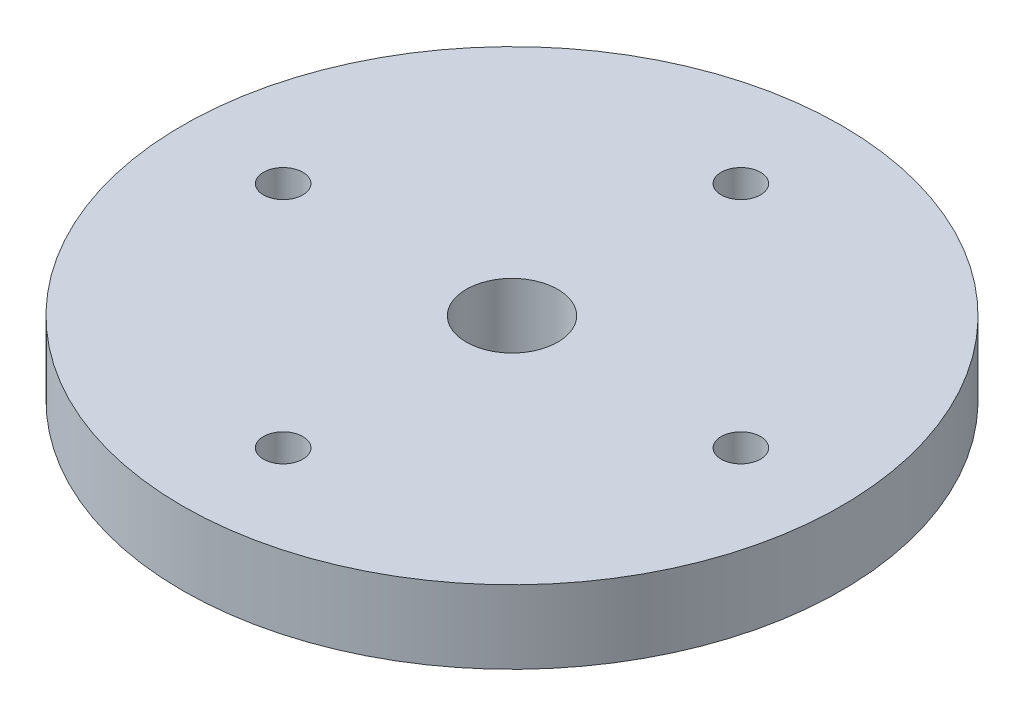
ISO-10303-21;
HEADER;
FILE_DESCRIPTION(('STEP AP214'),'2;1');
FILE_NAME('part.step','',(''),(''),'','','');
FILE_SCHEMA(('AUTOMOTIVE_DESIGN { 1 0 10303 214 1 1 1 1 }'));
ENDSEC;
DATA;
#1=APPLICATION_CONTEXT('core data for automotive mechanical design processes');
#2=APPLICATION_PROTOCOL_DEFINITION('international standard','automotive_design',2000,#1);
#3=PRODUCT_CONTEXT('',#1,'mechanical');
#4=PRODUCT('Part','Part','',(#3));
#5=PRODUCT_RELATED_PRODUCT_CATEGORY('part','',(#4));
#6=PRODUCT_DEFINITION_FORMATION('','',#4);
#7=PRODUCT_DEFINITION_CONTEXT('part definition',#1,'design');
#8=PRODUCT_DEFINITION('design','',#6,#7);
#9=PRODUCT_DEFINITION_SHAPE('','',#8);
#10=(LENGTH_UNIT() NAMED_UNIT(*) SI_UNIT(.MILLI.,.METRE.));
#11=(NAMED_UNIT(*) PLANE_ANGLE_UNIT() SI_UNIT($,.RADIAN.));
#12=(NAMED_UNIT(*) SI_UNIT($,.STERADIAN.) SOLID_ANGLE_UNIT());
#13=UNCERTAINTY_MEASURE_WITH_UNIT(LENGTH_MEASURE(1.E-05),#10,'distance_accuracy_value','');
#14=(GEOMETRIC_REPRESENTATION_CONTEXT(3) GLOBAL_UNCERTAINTY_ASSIGNED_CONTEXT((#13)) GLOBAL_UNIT_ASSIGNED_CONTEXT((#10,
#11,#12)) REPRESENTATION_CONTEXT('',''));
#15=CARTESIAN_POINT('',(0.,0.,0.));
#16=DIRECTION('',(0.,0.,1.));
#17=DIRECTION('',(1.,0.,0.));
#18=AXIS2_PLACEMENT_3D('',#15,#16,#17);
#19=CARTESIAN_POINT('',(0.,8.,0.));
#20=DIRECTION('',(0.,-1.,0.));
#21=DIRECTION('',(0.,0.,-1.));
#22=AXIS2_PLACEMENT_3D('',#19,#20,#21);
#23=CYLINDRICAL_SURFACE('',#22,36.);
#24=CARTESIAN_POINT('',(0.,8.,0.));
#25=DIRECTION('',(0.,1.,0.));
#26=DIRECTION('',(0.,0.,1.));
#27=AXIS2_PLACEMENT_3D('',#24,#25,#26);
#28=CIRCLE('',#27,36.);
#29=CARTESIAN_POINT('',(0.,8.,36.));
#30=VERTEX_POINT('',#29);
#31=EDGE_CURVE('E10',#30,#30,#28,.T.);
#32=ORIENTED_EDGE('',*,*,#31,.F.);
#33=EDGE_LOOP('',(#32));
#34=FACE_BOUND('',#33,.T.);
#35=CARTESIAN_POINT('',(0.,0.,0.));
#36=DIRECTION('',(0.,1.,0.));
#37=DIRECTION('',(0.,0.,1.));
#38=AXIS2_PLACEMENT_3D('',#35,#36,#37);
#39=CIRCLE('',#38,36.);
#40=CARTESIAN_POINT('',(0.,0.,36.));
#41=VERTEX_POINT('',#40);
#42=EDGE_CURVE('E36',#41,#41,#39,.T.);
#43=ORIENTED_EDGE('',*,*,#42,.T.);
#44=EDGE_LOOP('',(#43));
#45=FACE_BOUND('',#44,.T.);
#46=ADVANCED_FACE('F33',(#34,#45),#23,.T.);
#47=CARTESIAN_POINT('',(0.,8.,0.));
#48=DIRECTION('',(0.,1.,0.));
#49=DIRECTION('',(0.,0.,1.));
#50=AXIS2_PLACEMENT_3D('',#47,#48,#49);
#51=PLANE('',#50);
#52=CARTESIAN_POINT('',(-2.40354349096371E-13,8.,-25.));
#53=DIRECTION('',(0.,1.,0.));
#54=DIRECTION('',(0.,0.,1.));
#55=AXIS2_PLACEMENT_3D('',#52,#53,#54);
#56=CIRCLE('',#55,2.15);
#57=CARTESIAN_POINT('',(-2.40354349096371E-13,8.,-22.85));
#58=VERTEX_POINT('',#57);
#59=EDGE_CURVE('E58',#58,#58,#56,.T.);
#60=ORIENTED_EDGE('',*,*,#59,.F.);
#61=EDGE_LOOP('',(#60));
#62=FACE_BOUND('',#61,.T.);
#63=CARTESIAN_POINT('',(-24.9999999999995,8.,7.105427357601E-13));
#64=DIRECTION('',(0.,1.,0.));
#65=DIRECTION('',(0.,0.,1.));
#66=AXIS2_PLACEMENT_3D('',#63,#64,#65);
#67=CIRCLE('',#66,2.15);
#68=CARTESIAN_POINT('',(-24.9999999999995,8.,2.15000000000071));
#69=VERTEX_POINT('',#68);
#70=EDGE_CURVE('E59',#69,#69,#67,.T.);
#71=ORIENTED_EDGE('',*,*,#70,.F.);
#72=EDGE_LOOP('',(#71));
#73=FACE_BOUND('',#72,.T.);
#74=CARTESIAN_POINT('',(1.17460788842809E-12,8.,25.));
#75=DIRECTION('',(0.,1.,0.));
#76=DIRECTION('',(0.,0.,1.));
#77=AXIS2_PLACEMENT_3D('',#74,#75,#76);
#78=CIRCLE('',#77,2.15);
#79=CARTESIAN_POINT('',(1.17460788842809E-12,8.,27.15));
#80=VERTEX_POINT('',#79);
#81=EDGE_CURVE('E65',#80,#80,#78,.T.);
#82=ORIENTED_EDGE('',*,*,#81,.F.);
#83=EDGE_LOOP('',(#82));
#84=FACE_BOUND('',#83,.T.);
#85=CARTESIAN_POINT('',(25.0000000000005,8.,-7.07481118762232E-13));
#86=DIRECTION('',(0.,1.,0.));
#87=DIRECTION('',(0.,0.,1.));
#88=AXIS2_PLACEMENT_3D('',#85,#86,#87);
#89=CIRCLE('',#88,2.15);
#90=CARTESIAN_POINT('',(25.0000000000005,8.,2.14999999999929));
#91=VERTEX_POINT('',#90);
#92=EDGE_CURVE('E45',#91,#91,#89,.T.);
#93=ORIENTED_EDGE('',*,*,#92,.F.);
#94=EDGE_LOOP('',(#93));
#95=FACE_BOUND('',#94,.T.);
#96=CARTESIAN_POINT('',(0.,8.,0.));
#97=DIRECTION('',(0.,1.,0.));
#98=DIRECTION('',(0.,0.,1.));
#99=AXIS2_PLACEMENT_3D('',#96,#97,#98);
#100=CIRCLE('',#99,5.);
#101=CARTESIAN_POINT('',(0.,8.,5.));
#102=VERTEX_POINT('',#101);
#103=EDGE_CURVE('E52',#102,#102,#100,.T.);
#104=ORIENTED_EDGE('',*,*,#103,.F.);
#105=EDGE_LOOP('',(#104));
#106=FACE_BOUND('',#105,.T.);
#107=ORIENTED_EDGE('',*,*,#31,.T.);
#108=EDGE_LOOP('',(#107));
#109=FACE_BOUND('',#108,.T.);
#110=ADVANCED_FACE('F85',(#62,#73,#84,#95,#106,#109),#51,.T.);
#111=CARTESIAN_POINT('',(0.,0.,0.));
#112=DIRECTION('',(0.,1.,0.));
#113=DIRECTION('',(0.,0.,1.));
#114=AXIS2_PLACEMENT_3D('',#111,#112,#113);
#115=PLANE('',#114);
#116=CARTESIAN_POINT('',(-2.40354349096371E-13,0.,-25.));
#117=DIRECTION('',(0.,1.,0.));
#118=DIRECTION('',(0.,0.,1.));
#119=AXIS2_PLACEMENT_3D('',#116,#117,#118);
#120=CIRCLE('',#119,2.15);
#121=CARTESIAN_POINT('',(-2.40354349096371E-13,0.,-22.85));
#122=VERTEX_POINT('',#121);
#123=EDGE_CURVE('E43',#122,#122,#120,.T.);
#124=ORIENTED_EDGE('',*,*,#123,.T.);
#125=EDGE_LOOP('',(#124));
#126=FACE_BOUND('',#125,.T.);
#127=CARTESIAN_POINT('',(-24.9999999999995,0.,7.105427357601E-13));
#128=DIRECTION('',(0.,1.,0.));
#129=DIRECTION('',(0.,0.,1.));
#130=AXIS2_PLACEMENT_3D('',#127,#128,#129);
#131=CIRCLE('',#130,2.15);
#132=CARTESIAN_POINT('',(-24.9999999999995,0.,2.15000000000071));
#133=VERTEX_POINT('',#132);
#134=EDGE_CURVE('E62',#133,#133,#131,.T.);
#135=ORIENTED_EDGE('',*,*,#134,.T.);
#136=EDGE_LOOP('',(#135));
#137=FACE_BOUND('',#136,.T.);
#138=CARTESIAN_POINT('',(1.17460788842809E-12,0.,25.));
#139=DIRECTION('',(0.,1.,0.));
#140=DIRECTION('',(0.,0.,1.));
#141=AXIS2_PLACEMENT_3D('',#138,#139,#140);
#142=CIRCLE('',#141,2.15);
#143=CARTESIAN_POINT('',(1.17460788842809E-12,0.,27.15));
#144=VERTEX_POINT('',#143);
#145=EDGE_CURVE('E49',#144,#144,#142,.T.);
#146=ORIENTED_EDGE('',*,*,#145,.T.);
#147=EDGE_LOOP('',(#146));
#148=FACE_BOUND('',#147,.T.);
#149=CARTESIAN_POINT('',(25.0000000000005,0.,-7.07481118762232E-13));
#150=DIRECTION('',(0.,1.,0.));
#151=DIRECTION('',(0.,0.,1.));
#152=AXIS2_PLACEMENT_3D('',#149,#150,#151);
#153=CIRCLE('',#152,2.15);
#154=CARTESIAN_POINT('',(25.0000000000005,0.,2.14999999999929));
#155=VERTEX_POINT('',#154);
#156=EDGE_CURVE('E48',#155,#155,#153,.T.);
#157=ORIENTED_EDGE('',*,*,#156,.T.);
#158=EDGE_LOOP('',(#157));
#159=FACE_BOUND('',#158,.T.);
#160=CARTESIAN_POINT('',(0.,0.,0.));
#161=DIRECTION('',(0.,1.,0.));
#162=DIRECTION('',(0.,0.,1.));
#163=AXIS2_PLACEMENT_3D('',#160,#161,#162);
#164=CIRCLE('',#163,5.);
#165=CARTESIAN_POINT('',(0.,0.,5.));
#166=VERTEX_POINT('',#165);
#167=EDGE_CURVE('E55',#166,#166,#164,.T.);
#168=ORIENTED_EDGE('',*,*,#167,.T.);
#169=EDGE_LOOP('',(#168));
#170=FACE_BOUND('',#169,.T.);
#171=ORIENTED_EDGE('',*,*,#42,.F.);
#172=EDGE_LOOP('',(#171));
#173=FACE_BOUND('',#172,.T.);
#174=ADVANCED_FACE('F75',(#126,#137,#148,#159,#170,#173),#115,.F.);
#175=CARTESIAN_POINT('',(0.,0.,0.));
#176=DIRECTION('',(0.,1.,0.));
#177=DIRECTION('',(0.,0.,1.));
#178=AXIS2_PLACEMENT_3D('',#175,#176,#177);
#179=CYLINDRICAL_SURFACE('',#178,5.);
#180=ORIENTED_EDGE('',*,*,#167,.F.);
#181=EDGE_LOOP('',(#180));
#182=FACE_BOUND('',#181,.T.);
#183=ORIENTED_EDGE('',*,*,#103,.T.);
#184=EDGE_LOOP('',(#183));
#185=FACE_BOUND('',#184,.T.);
#186=ADVANCED_FACE('F97',(#182,#185),#179,.F.);
#187=CARTESIAN_POINT('',(25.0000000000005,0.,-7.07481118762232E-13));
#188=DIRECTION('',(0.,1.,0.));
#189=DIRECTION('',(0.,0.,1.));
#190=AXIS2_PLACEMENT_3D('',#187,#188,#189);
#191=CYLINDRICAL_SURFACE('',#190,2.15);
#192=ORIENTED_EDGE('',*,*,#156,.F.);
#193=EDGE_LOOP('',(#192));
#194=FACE_BOUND('',#193,.T.);
#195=ORIENTED_EDGE('',*,*,#92,.T.);
#196=EDGE_LOOP('',(#195));
#197=FACE_BOUND('',#196,.T.);
#198=ADVANCED_FACE('F99',(#194,#197),#191,.F.);
#199=CARTESIAN_POINT('',(1.17460788842809E-12,0.,25.));
#200=DIRECTION('',(0.,1.,0.));
#201=DIRECTION('',(0.,0.,1.));
#202=AXIS2_PLACEMENT_3D('',#199,#200,#201);
#203=CYLINDRICAL_SURFACE('',#202,2.15);
#204=ORIENTED_EDGE('',*,*,#145,.F.);
#205=EDGE_LOOP('',(#204));
#206=FACE_BOUND('',#205,.T.);
#207=ORIENTED_EDGE('',*,*,#81,.T.);
#208=EDGE_LOOP('',(#207));
#209=FACE_BOUND('',#208,.T.);
#210=ADVANCED_FACE('F106',(#206,#209),#203,.F.);
#211=CARTESIAN_POINT('',(-24.9999999999995,0.,7.105427357601E-13));
#212=DIRECTION('',(0.,1.,0.));
#213=DIRECTION('',(0.,0.,1.));
#214=AXIS2_PLACEMENT_3D('',#211,#212,#213);
#215=CYLINDRICAL_SURFACE('',#214,2.15);
#216=ORIENTED_EDGE('',*,*,#134,.F.);
#217=EDGE_LOOP('',(#216));
#218=FACE_BOUND('',#217,.T.);
#219=ORIENTED_EDGE('',*,*,#70,.T.);
#220=EDGE_LOOP('',(#219));
#221=FACE_BOUND('',#220,.T.);
#222=ADVANCED_FACE('F81',(#218,#221),#215,.F.);
#223=CARTESIAN_POINT('',(-2.40354349096371E-13,0.,-25.));
#224=DIRECTION('',(0.,1.,0.));
#225=DIRECTION('',(0.,0.,1.));
#226=AXIS2_PLACEMENT_3D('',#223,#224,#225);
#227=CYLINDRICAL_SURFACE('',#226,2.15);
#228=ORIENTED_EDGE('',*,*,#123,.F.);
#229=EDGE_LOOP('',(#228));
#230=FACE_BOUND('',#229,.T.);
#231=ORIENTED_EDGE('',*,*,#59,.T.);
#232=EDGE_LOOP('',(#231));
#233=FACE_BOUND('',#232,.T.);
#234=ADVANCED_FACE('F78',(#230,#233),#227,.F.);
#235=CLOSED_SHELL('',(#46,#110,#174,#186,#198,#210,#222,#234));
#236=MANIFOLD_SOLID_BREP('B2',#235);
#237=ADVANCED_BREP_SHAPE_REPRESENTATION('',(#18,#236),#14);
#238=SHAPE_DEFINITION_REPRESENTATION(#9,#237);
ENDSEC;
END-ISO-10303-21;
